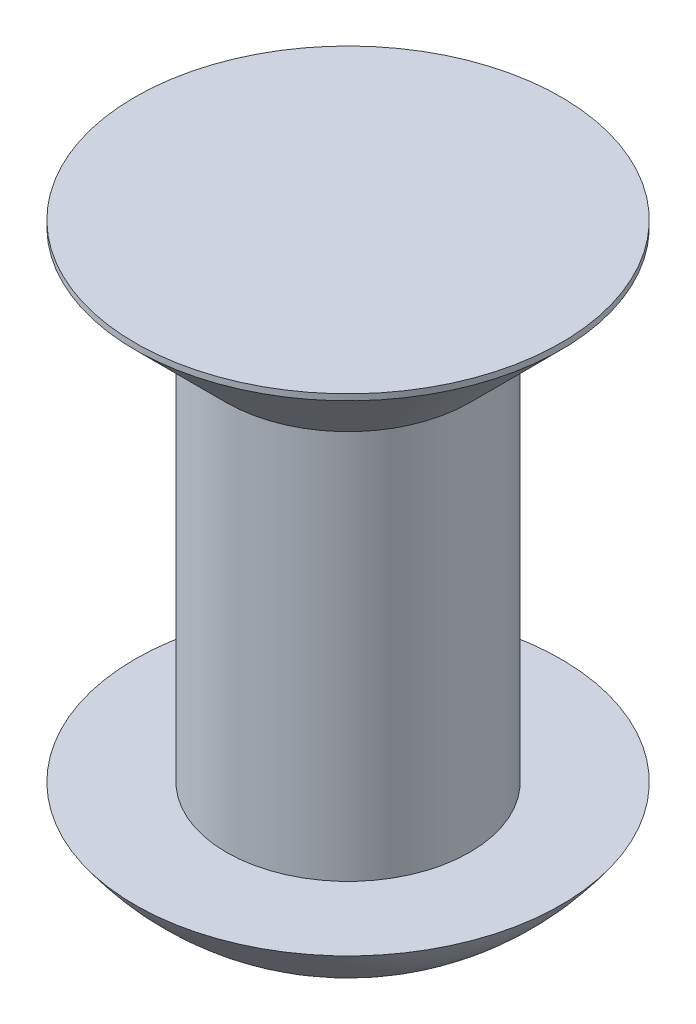
ISO-10303-21;
HEADER;
FILE_DESCRIPTION(('STEP AP214'),'2;1');
FILE_NAME('part.step','',(''),(''),'','','');
FILE_SCHEMA(('AUTOMOTIVE_DESIGN { 1 0 10303 214 1 1 1 1 }'));
ENDSEC;
DATA;
#1=APPLICATION_CONTEXT('core data for automotive mechanical design processes');
#2=APPLICATION_PROTOCOL_DEFINITION('international standard','automotive_design',2000,#1);
#3=PRODUCT_CONTEXT('',#1,'mechanical');
#4=PRODUCT('Part','Part','',(#3));
#5=PRODUCT_RELATED_PRODUCT_CATEGORY('part','',(#4));
#6=PRODUCT_DEFINITION_FORMATION('','',#4);
#7=PRODUCT_DEFINITION_CONTEXT('part definition',#1,'design');
#8=PRODUCT_DEFINITION('design','',#6,#7);
#9=PRODUCT_DEFINITION_SHAPE('','',#8);
#10=(LENGTH_UNIT() NAMED_UNIT(*) SI_UNIT(.MILLI.,.METRE.));
#11=(NAMED_UNIT(*) PLANE_ANGLE_UNIT() SI_UNIT($,.RADIAN.));
#12=(NAMED_UNIT(*) SI_UNIT($,.STERADIAN.) SOLID_ANGLE_UNIT());
#13=UNCERTAINTY_MEASURE_WITH_UNIT(LENGTH_MEASURE(1.E-05),#10,'distance_accuracy_value','');
#14=(GEOMETRIC_REPRESENTATION_CONTEXT(3) GLOBAL_UNCERTAINTY_ASSIGNED_CONTEXT((#13)) GLOBAL_UNIT_ASSIGNED_CONTEXT((#10,
#11,#12)) REPRESENTATION_CONTEXT('',''));
#15=CARTESIAN_POINT('',(0.,0.,0.));
#16=DIRECTION('',(0.,0.,1.));
#17=DIRECTION('',(1.,0.,0.));
#18=AXIS2_PLACEMENT_3D('',#15,#16,#17);
#19=CARTESIAN_POINT('',(3.5,8.,0.));
#20=DIRECTION('',(0.,-1.,0.));
#21=DIRECTION('',(1.,0.,0.));
#22=AXIS2_PLACEMENT_3D('',#19,#20,#21);
#23=PLANE('',#22);
#24=CARTESIAN_POINT('',(0.,8.,0.));
#25=DIRECTION('',(0.,1.,0.));
#26=DIRECTION('',(-1.,0.,0.));
#27=AXIS2_PLACEMENT_3D('',#24,#25,#26);
#28=CIRCLE('',#27,3.5);
#29=CARTESIAN_POINT('',(-3.5,8.,0.));
#30=VERTEX_POINT('',#29);
#31=EDGE_CURVE('E11',#30,#30,#28,.T.);
#32=ORIENTED_EDGE('',*,*,#31,.T.);
#33=EDGE_LOOP('',(#32));
#34=FACE_BOUND('',#33,.T.);
#35=ADVANCED_FACE('F31',(#34),#23,.F.);
#36=CARTESIAN_POINT('',(0.,8.,0.));
#37=DIRECTION('',(0.,1.,0.));
#38=DIRECTION('',(-1.,0.,0.));
#39=AXIS2_PLACEMENT_3D('',#36,#37,#38);
#40=CYLINDRICAL_SURFACE('',#39,3.5);
#41=ORIENTED_EDGE('',*,*,#31,.F.);
#42=EDGE_LOOP('',(#41));
#43=FACE_BOUND('',#42,.T.);
#44=CARTESIAN_POINT('',(0.,7.9,0.));
#45=DIRECTION('',(0.,1.,0.));
#46=DIRECTION('',(-1.,0.,0.));
#47=AXIS2_PLACEMENT_3D('',#44,#45,#46);
#48=CIRCLE('',#47,3.5);
#49=CARTESIAN_POINT('',(-3.5,7.9,0.));
#50=VERTEX_POINT('',#49);
#51=EDGE_CURVE('E37',#50,#50,#48,.T.);
#52=ORIENTED_EDGE('',*,*,#51,.T.);
#53=EDGE_LOOP('',(#52));
#54=FACE_BOUND('',#53,.T.);
#55=ADVANCED_FACE('F53',(#43,#54),#40,.T.);
#56=CARTESIAN_POINT('',(0.,6.4,0.));
#57=DIRECTION('',(0.,1.,0.));
#58=DIRECTION('',(-1.,0.,0.));
#59=AXIS2_PLACEMENT_3D('',#56,#57,#58);
#60=CONICAL_SURFACE('',#59,2.,0.78539816339745);
#61=ORIENTED_EDGE('',*,*,#51,.F.);
#62=EDGE_LOOP('',(#61));
#63=FACE_BOUND('',#62,.T.);
#64=CARTESIAN_POINT('',(0.,6.4,0.));
#65=DIRECTION('',(0.,1.,0.));
#66=DIRECTION('',(-1.,0.,0.));
#67=AXIS2_PLACEMENT_3D('',#64,#65,#66);
#68=CIRCLE('',#67,2.);
#69=CARTESIAN_POINT('',(-2.,6.4,0.));
#70=VERTEX_POINT('',#69);
#71=EDGE_CURVE('E65',#70,#70,#68,.T.);
#72=ORIENTED_EDGE('',*,*,#71,.T.);
#73=EDGE_LOOP('',(#72));
#74=FACE_BOUND('',#73,.T.);
#75=ADVANCED_FACE('F58',(#63,#74),#60,.T.);
#76=CARTESIAN_POINT('',(0.,8.,0.));
#77=DIRECTION('',(0.,1.,0.));
#78=DIRECTION('',(-1.,0.,0.));
#79=AXIS2_PLACEMENT_3D('',#76,#77,#78);
#80=CYLINDRICAL_SURFACE('',#79,2.);
#81=ORIENTED_EDGE('',*,*,#71,.F.);
#82=EDGE_LOOP('',(#81));
#83=FACE_BOUND('',#82,.T.);
#84=CARTESIAN_POINT('',(0.,0.,0.));
#85=DIRECTION('',(0.,1.,0.));
#86=DIRECTION('',(-1.,0.,0.));
#87=AXIS2_PLACEMENT_3D('',#84,#85,#86);
#88=CIRCLE('',#87,2.);
#89=CARTESIAN_POINT('',(-2.,0.,0.));
#90=VERTEX_POINT('',#89);
#91=EDGE_CURVE('E67',#90,#90,#88,.T.);
#92=ORIENTED_EDGE('',*,*,#91,.T.);
#93=EDGE_LOOP('',(#92));
#94=FACE_BOUND('',#93,.T.);
#95=ADVANCED_FACE('F48',(#83,#94),#80,.T.);
#96=CARTESIAN_POINT('',(2.,0.,0.));
#97=DIRECTION('',(0.,-1.,0.));
#98=DIRECTION('',(1.,0.,0.));
#99=AXIS2_PLACEMENT_3D('',#96,#97,#98);
#100=PLANE('',#99);
#101=ORIENTED_EDGE('',*,*,#91,.F.);
#102=EDGE_LOOP('',(#101));
#103=FACE_BOUND('',#102,.T.);
#104=CARTESIAN_POINT('',(0.,0.,0.));
#105=DIRECTION('',(0.,1.,0.));
#106=DIRECTION('',(-1.,0.,0.));
#107=AXIS2_PLACEMENT_3D('',#104,#105,#106);
#108=CIRCLE('',#107,3.5);
#109=CARTESIAN_POINT('',(-3.5,0.,0.));
#110=VERTEX_POINT('',#109);
#111=EDGE_CURVE('E72',#110,#110,#108,.T.);
#112=ORIENTED_EDGE('',*,*,#111,.T.);
#113=EDGE_LOOP('',(#112));
#114=FACE_BOUND('',#113,.T.);
#115=ADVANCED_FACE('F42',(#103,#114),#100,.F.);
#116=CARTESIAN_POINT('',(-0.000867038662504445,2.42632504826003,0.));
#117=DIRECTION('',(0.,0.,-1.));
#118=DIRECTION('',(-1.,0.,0.));
#119=AXIS2_PLACEMENT_3D('',#116,#117,#118);
#120=CIRCLE('',#119,4.25804940329872);
#121=TRIMMED_CURVE('',#120,(PARAMETER_VALUE(-1.5709999502352)),
(PARAMETER_VALUE(1.5709999502352)),.T.,.PARAMETER.);
#122=CARTESIAN_POINT('',(0.,2.42632504826003,0.));
#123=DIRECTION('',(0.,1.,0.));
#124=AXIS1_PLACEMENT('',#122,#123);
#125=SURFACE_OF_REVOLUTION('',#121,#124);
#126=ORIENTED_EDGE('',*,*,#111,.F.);
#127=EDGE_LOOP('',(#126));
#128=FACE_BOUND('',#127,.T.);
#129=CARTESIAN_POINT('',(0.,-1.83172426676399,0.));
#130=VERTEX_POINT('',#129);
#131=VERTEX_LOOP('',#130);
#132=FACE_BOUND('',#131,.T.);
#133=ADVANCED_FACE('F40',(#128,#132),#125,.T.);
#134=CLOSED_SHELL('',(#35,#55,#75,#95,#115,#133));
#135=MANIFOLD_SOLID_BREP('B2',#134);
#136=ADVANCED_BREP_SHAPE_REPRESENTATION('',(#18,#135),#14);
#137=SHAPE_DEFINITION_REPRESENTATION(#9,#136);
ENDSEC;
END-ISO-10303-21;
